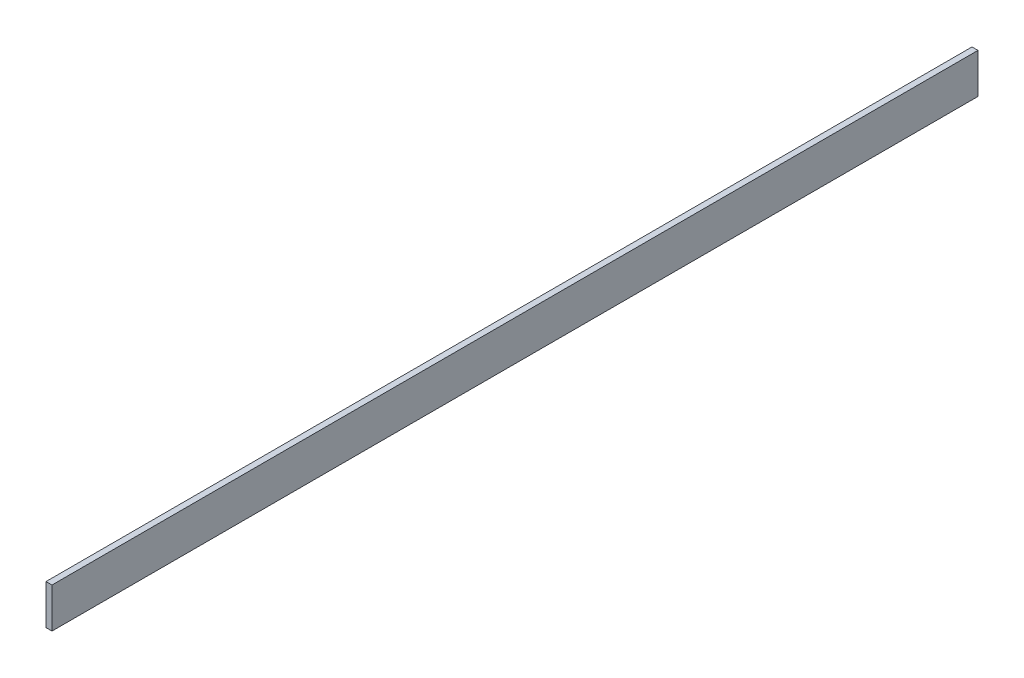
ISO-10303-21;
HEADER;
FILE_DESCRIPTION(('STEP AP214'),'2;1');
FILE_NAME('part.step','',(''),(''),'','','');
FILE_SCHEMA(('AUTOMOTIVE_DESIGN { 1 0 10303 214 1 1 1 1 }'));
ENDSEC;
DATA;
#1=APPLICATION_CONTEXT('core data for automotive mechanical design processes');
#2=APPLICATION_PROTOCOL_DEFINITION('international standard','automotive_design',2000,#1);
#3=PRODUCT_CONTEXT('',#1,'mechanical');
#4=PRODUCT('Part','Part','',(#3));
#5=PRODUCT_RELATED_PRODUCT_CATEGORY('part','',(#4));
#6=PRODUCT_DEFINITION_FORMATION('','',#4);
#7=PRODUCT_DEFINITION_CONTEXT('part definition',#1,'design');
#8=PRODUCT_DEFINITION('design','',#6,#7);
#9=PRODUCT_DEFINITION_SHAPE('','',#8);
#10=(LENGTH_UNIT() NAMED_UNIT(*) SI_UNIT(.MILLI.,.METRE.));
#11=(NAMED_UNIT(*) PLANE_ANGLE_UNIT() SI_UNIT($,.RADIAN.));
#12=(NAMED_UNIT(*) SI_UNIT($,.STERADIAN.) SOLID_ANGLE_UNIT());
#13=UNCERTAINTY_MEASURE_WITH_UNIT(LENGTH_MEASURE(1.E-05),#10,'distance_accuracy_value','');
#14=(GEOMETRIC_REPRESENTATION_CONTEXT(3) GLOBAL_UNCERTAINTY_ASSIGNED_CONTEXT((#13)) GLOBAL_UNIT_ASSIGNED_CONTEXT((#10,
#11,#12)) REPRESENTATION_CONTEXT('',''));
#15=CARTESIAN_POINT('',(0.,0.,0.));
#16=DIRECTION('',(0.,0.,1.));
#17=DIRECTION('',(1.,0.,0.));
#18=AXIS2_PLACEMENT_3D('',#15,#16,#17);
#19=CARTESIAN_POINT('',(0.,0.,464.));
#20=DIRECTION('',(1.,0.,0.));
#21=DIRECTION('',(0.,1.,0.));
#22=AXIS2_PLACEMENT_3D('',#19,#20,#21);
#23=PLANE('',#22);
#24=DIRECTION('',(0.,-1.,0.));
#25=VECTOR('',#24,1.);
#26=CARTESIAN_POINT('',(0.,0.,0.));
#27=LINE('',#26,#25);
#28=CARTESIAN_POINT('',(0.,20.,0.));
#29=VERTEX_POINT('',#28);
#30=CARTESIAN_POINT('',(0.,0.,0.));
#31=VERTEX_POINT('',#30);
#32=EDGE_CURVE('E96',#29,#31,#27,.T.);
#33=ORIENTED_EDGE('',*,*,#32,.T.);
#34=DIRECTION('',(0.,0.,-1.));
#35=VECTOR('',#34,1.);
#36=CARTESIAN_POINT('',(0.,0.,464.));
#37=LINE('',#36,#35);
#38=CARTESIAN_POINT('',(0.,0.,464.));
#39=VERTEX_POINT('',#38);
#40=EDGE_CURVE('E11',#39,#31,#37,.T.);
#41=ORIENTED_EDGE('',*,*,#40,.F.);
#42=DIRECTION('',(0.,-1.,0.));
#43=VECTOR('',#42,1.);
#44=CARTESIAN_POINT('',(0.,0.,464.));
#45=LINE('',#44,#43);
#46=CARTESIAN_POINT('',(0.,20.,464.));
#47=VERTEX_POINT('',#46);
#48=EDGE_CURVE('E84',#47,#39,#45,.T.);
#49=ORIENTED_EDGE('',*,*,#48,.F.);
#50=DIRECTION('',(0.,0.,-1.));
#51=VECTOR('',#50,1.);
#52=CARTESIAN_POINT('',(0.,20.,464.));
#53=LINE('',#52,#51);
#54=EDGE_CURVE('E92',#47,#29,#53,.T.);
#55=ORIENTED_EDGE('',*,*,#54,.T.);
#56=EDGE_LOOP('',(#33,#41,#49,#55));
#57=FACE_BOUND('',#56,.T.);
#58=ADVANCED_FACE('F33',(#57),#23,.F.);
#59=CARTESIAN_POINT('',(0.,0.,464.));
#60=DIRECTION('',(0.,1.,0.));
#61=DIRECTION('',(0.,0.,1.));
#62=AXIS2_PLACEMENT_3D('',#59,#60,#61);
#63=PLANE('',#62);
#64=DIRECTION('',(1.,0.,0.));
#65=VECTOR('',#64,1.);
#66=CARTESIAN_POINT('',(0.,0.,0.));
#67=LINE('',#66,#65);
#68=CARTESIAN_POINT('',(3.,0.,0.));
#69=VERTEX_POINT('',#68);
#70=EDGE_CURVE('E88',#31,#69,#67,.T.);
#71=ORIENTED_EDGE('',*,*,#70,.T.);
#72=DIRECTION('',(0.,0.,-1.));
#73=VECTOR('',#72,1.);
#74=CARTESIAN_POINT('',(3.,0.,464.));
#75=LINE('',#74,#73);
#76=CARTESIAN_POINT('',(3.,0.,464.));
#77=VERTEX_POINT('',#76);
#78=EDGE_CURVE('E41',#77,#69,#75,.T.);
#79=ORIENTED_EDGE('',*,*,#78,.F.);
#80=DIRECTION('',(1.,0.,0.));
#81=VECTOR('',#80,1.);
#82=CARTESIAN_POINT('',(0.,0.,464.));
#83=LINE('',#82,#81);
#84=EDGE_CURVE('E79',#39,#77,#83,.T.);
#85=ORIENTED_EDGE('',*,*,#84,.F.);
#86=ORIENTED_EDGE('',*,*,#40,.T.);
#87=EDGE_LOOP('',(#71,#79,#85,#86));
#88=FACE_BOUND('',#87,.T.);
#89=ADVANCED_FACE('F87',(#88),#63,.F.);
#90=CARTESIAN_POINT('',(3.,0.,464.));
#91=DIRECTION('',(-1.,0.,0.));
#92=DIRECTION('',(0.,-1.,0.));
#93=AXIS2_PLACEMENT_3D('',#90,#91,#92);
#94=PLANE('',#93);
#95=DIRECTION('',(0.,1.,0.));
#96=VECTOR('',#95,1.);
#97=CARTESIAN_POINT('',(3.,0.,0.));
#98=LINE('',#97,#96);
#99=CARTESIAN_POINT('',(3.,20.,0.));
#100=VERTEX_POINT('',#99);
#101=EDGE_CURVE('E66',#69,#100,#98,.T.);
#102=ORIENTED_EDGE('',*,*,#101,.T.);
#103=DIRECTION('',(0.,0.,-1.));
#104=VECTOR('',#103,1.);
#105=CARTESIAN_POINT('',(3.,20.,464.));
#106=LINE('',#105,#104);
#107=CARTESIAN_POINT('',(3.,20.,464.));
#108=VERTEX_POINT('',#107);
#109=EDGE_CURVE('E89',#108,#100,#106,.T.);
#110=ORIENTED_EDGE('',*,*,#109,.F.);
#111=DIRECTION('',(0.,1.,0.));
#112=VECTOR('',#111,1.);
#113=CARTESIAN_POINT('',(3.,0.,464.));
#114=LINE('',#113,#112);
#115=EDGE_CURVE('E82',#77,#108,#114,.T.);
#116=ORIENTED_EDGE('',*,*,#115,.F.);
#117=ORIENTED_EDGE('',*,*,#78,.T.);
#118=EDGE_LOOP('',(#102,#110,#116,#117));
#119=FACE_BOUND('',#118,.T.);
#120=ADVANCED_FACE('F90',(#119),#94,.F.);
#121=CARTESIAN_POINT('',(0.,20.,464.));
#122=DIRECTION('',(0.,-1.,0.));
#123=DIRECTION('',(0.,0.,-1.));
#124=AXIS2_PLACEMENT_3D('',#121,#122,#123);
#125=PLANE('',#124);
#126=DIRECTION('',(-1.,0.,0.));
#127=VECTOR('',#126,1.);
#128=CARTESIAN_POINT('',(0.,20.,0.));
#129=LINE('',#128,#127);
#130=EDGE_CURVE('E72',#100,#29,#129,.T.);
#131=ORIENTED_EDGE('',*,*,#130,.T.);
#132=ORIENTED_EDGE('',*,*,#54,.F.);
#133=DIRECTION('',(-1.,0.,0.));
#134=VECTOR('',#133,1.);
#135=CARTESIAN_POINT('',(0.,20.,464.));
#136=LINE('',#135,#134);
#137=EDGE_CURVE('E49',#108,#47,#136,.T.);
#138=ORIENTED_EDGE('',*,*,#137,.F.);
#139=ORIENTED_EDGE('',*,*,#109,.T.);
#140=EDGE_LOOP('',(#131,#132,#138,#139));
#141=FACE_BOUND('',#140,.T.);
#142=ADVANCED_FACE('F103',(#141),#125,.F.);
#143=CARTESIAN_POINT('',(0.,0.,464.));
#144=DIRECTION('',(0.,0.,-1.));
#145=DIRECTION('',(-1.,0.,0.));
#146=AXIS2_PLACEMENT_3D('',#143,#144,#145);
#147=PLANE('',#146);
#148=ORIENTED_EDGE('',*,*,#48,.T.);
#149=ORIENTED_EDGE('',*,*,#84,.T.);
#150=ORIENTED_EDGE('',*,*,#115,.T.);
#151=ORIENTED_EDGE('',*,*,#137,.T.);
#152=EDGE_LOOP('',(#148,#149,#150,#151));
#153=FACE_BOUND('',#152,.T.);
#154=ADVANCED_FACE('F80',(#153),#147,.F.);
#155=CARTESIAN_POINT('',(0.,0.,0.));
#156=DIRECTION('',(0.,0.,-1.));
#157=DIRECTION('',(-1.,0.,0.));
#158=AXIS2_PLACEMENT_3D('',#155,#156,#157);
#159=PLANE('',#158);
#160=ORIENTED_EDGE('',*,*,#32,.F.);
#161=ORIENTED_EDGE('',*,*,#130,.F.);
#162=ORIENTED_EDGE('',*,*,#101,.F.);
#163=ORIENTED_EDGE('',*,*,#70,.F.);
#164=EDGE_LOOP('',(#160,#161,#162,#163));
#165=FACE_BOUND('',#164,.T.);
#166=ADVANCED_FACE('F106',(#165),#159,.T.);
#167=CLOSED_SHELL('',(#58,#89,#120,#142,#154,#166));
#168=MANIFOLD_SOLID_BREP('B2',#167);
#169=ADVANCED_BREP_SHAPE_REPRESENTATION('',(#18,#168),#14);
#170=SHAPE_DEFINITION_REPRESENTATION(#9,#169);
ENDSEC;
END-ISO-10303-21;
